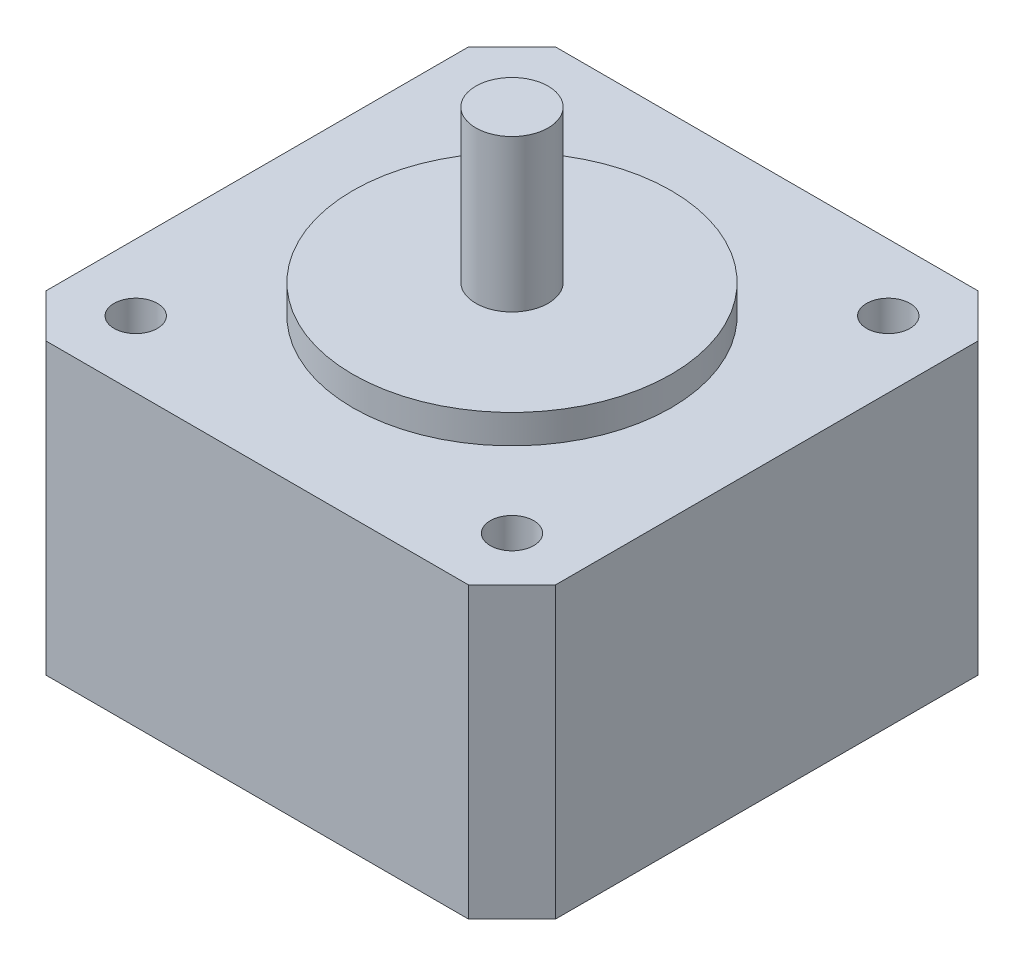
ISO-10303-21;
HEADER;
FILE_DESCRIPTION(('STEP AP214'),'2;1');
FILE_NAME('part.step','',(''),(''),'','','');
FILE_SCHEMA(('AUTOMOTIVE_DESIGN { 1 0 10303 214 1 1 1 1 }'));
ENDSEC;
DATA;
#1=APPLICATION_CONTEXT('core data for automotive mechanical design processes');
#2=APPLICATION_PROTOCOL_DEFINITION('international standard','automotive_design',2000,#1);
#3=PRODUCT_CONTEXT('',#1,'mechanical');
#4=PRODUCT('Part','Part','',(#3));
#5=PRODUCT_RELATED_PRODUCT_CATEGORY('part','',(#4));
#6=PRODUCT_DEFINITION_FORMATION('','',#4);
#7=PRODUCT_DEFINITION_CONTEXT('part definition',#1,'design');
#8=PRODUCT_DEFINITION('design','',#6,#7);
#9=PRODUCT_DEFINITION_SHAPE('','',#8);
#10=(LENGTH_UNIT() NAMED_UNIT(*) SI_UNIT(.MILLI.,.METRE.));
#11=(NAMED_UNIT(*) PLANE_ANGLE_UNIT() SI_UNIT($,.RADIAN.));
#12=(NAMED_UNIT(*) SI_UNIT($,.STERADIAN.) SOLID_ANGLE_UNIT());
#13=UNCERTAINTY_MEASURE_WITH_UNIT(LENGTH_MEASURE(1.E-05),#10,'distance_accuracy_value','');
#14=(GEOMETRIC_REPRESENTATION_CONTEXT(3) GLOBAL_UNCERTAINTY_ASSIGNED_CONTEXT((#13)) GLOBAL_UNIT_ASSIGNED_CONTEXT((#10,
#11,#12)) REPRESENTATION_CONTEXT('',''));
#15=CARTESIAN_POINT('',(0.,0.,0.));
#16=DIRECTION('',(0.,0.,1.));
#17=DIRECTION('',(1.,0.,0.));
#18=AXIS2_PLACEMENT_3D('',#15,#16,#17);
#19=CARTESIAN_POINT('',(17.6,20.,17.6));
#20=DIRECTION('',(-1.,0.,0.));
#21=DIRECTION('',(0.,0.,1.));
#22=AXIS2_PLACEMENT_3D('',#19,#20,#21);
#23=PLANE('',#22);
#24=DIRECTION('',(0.,0.,-1.));
#25=VECTOR('',#24,1.);
#26=CARTESIAN_POINT('',(17.6,0.,17.6));
#27=LINE('',#26,#25);
#28=CARTESIAN_POINT('',(17.6,0.,14.6));
#29=VERTEX_POINT('',#28);
#30=CARTESIAN_POINT('',(17.6,0.,-14.6));
#31=VERTEX_POINT('',#30);
#32=EDGE_CURVE('E166',#29,#31,#27,.T.);
#33=ORIENTED_EDGE('',*,*,#32,.T.);
#34=DIRECTION('',(0.,1.,0.));
#35=VECTOR('',#34,1.);
#36=CARTESIAN_POINT('',(17.6,20.,-14.6));
#37=LINE('',#36,#35);
#38=CARTESIAN_POINT('',(17.6,20.,-14.6));
#39=VERTEX_POINT('',#38);
#40=EDGE_CURVE('E11',#31,#39,#37,.T.);
#41=ORIENTED_EDGE('',*,*,#40,.T.);
#42=DIRECTION('',(0.,0.,-1.));
#43=VECTOR('',#42,1.);
#44=CARTESIAN_POINT('',(17.6,20.,17.6));
#45=LINE('',#44,#43);
#46=CARTESIAN_POINT('',(17.6,20.,14.6));
#47=VERTEX_POINT('',#46);
#48=EDGE_CURVE('E133',#47,#39,#45,.T.);
#49=ORIENTED_EDGE('',*,*,#48,.F.);
#50=DIRECTION('',(0.,-1.,0.));
#51=VECTOR('',#50,1.);
#52=CARTESIAN_POINT('',(17.6,20.,14.6));
#53=LINE('',#52,#51);
#54=EDGE_CURVE('E49',#47,#29,#53,.T.);
#55=ORIENTED_EDGE('',*,*,#54,.T.);
#56=EDGE_LOOP('',(#33,#41,#49,#55));
#57=FACE_BOUND('',#56,.T.);
#58=ADVANCED_FACE('F40',(#57),#23,.F.);
#59=CARTESIAN_POINT('',(-17.6,20.,-17.6));
#60=DIRECTION('',(0.,0.,1.));
#61=DIRECTION('',(1.,0.,0.));
#62=AXIS2_PLACEMENT_3D('',#59,#60,#61);
#63=PLANE('',#62);
#64=DIRECTION('',(-1.,0.,0.));
#65=VECTOR('',#64,1.);
#66=CARTESIAN_POINT('',(-17.6,0.,-17.6));
#67=LINE('',#66,#65);
#68=CARTESIAN_POINT('',(14.6,0.,-17.6));
#69=VERTEX_POINT('',#68);
#70=CARTESIAN_POINT('',(-14.6,0.,-17.6));
#71=VERTEX_POINT('',#70);
#72=EDGE_CURVE('E138',#69,#71,#67,.T.);
#73=ORIENTED_EDGE('',*,*,#72,.T.);
#74=DIRECTION('',(0.,1.,0.));
#75=VECTOR('',#74,1.);
#76=CARTESIAN_POINT('',(-14.6,20.,-17.6));
#77=LINE('',#76,#75);
#78=CARTESIAN_POINT('',(-14.6,20.,-17.6));
#79=VERTEX_POINT('',#78);
#80=EDGE_CURVE('E56',#71,#79,#77,.T.);
#81=ORIENTED_EDGE('',*,*,#80,.T.);
#82=DIRECTION('',(-1.,0.,0.));
#83=VECTOR('',#82,1.);
#84=CARTESIAN_POINT('',(-17.6,20.,-17.6));
#85=LINE('',#84,#83);
#86=CARTESIAN_POINT('',(14.6,20.,-17.6));
#87=VERTEX_POINT('',#86);
#88=EDGE_CURVE('E136',#87,#79,#85,.T.);
#89=ORIENTED_EDGE('',*,*,#88,.F.);
#90=DIRECTION('',(0.,-1.,0.));
#91=VECTOR('',#90,1.);
#92=CARTESIAN_POINT('',(14.6,20.,-17.6));
#93=LINE('',#92,#91);
#94=EDGE_CURVE('E158',#87,#69,#93,.T.);
#95=ORIENTED_EDGE('',*,*,#94,.T.);
#96=EDGE_LOOP('',(#73,#81,#89,#95));
#97=FACE_BOUND('',#96,.T.);
#98=ADVANCED_FACE('F231',(#97),#63,.F.);
#99=CARTESIAN_POINT('',(-17.6,20.,17.6));
#100=DIRECTION('',(1.,0.,0.));
#101=DIRECTION('',(0.,0.,-1.));
#102=AXIS2_PLACEMENT_3D('',#99,#100,#101);
#103=PLANE('',#102);
#104=DIRECTION('',(0.,0.,1.));
#105=VECTOR('',#104,1.);
#106=CARTESIAN_POINT('',(-17.6,0.,17.6));
#107=LINE('',#106,#105);
#108=CARTESIAN_POINT('',(-17.6,0.,-14.6));
#109=VERTEX_POINT('',#108);
#110=CARTESIAN_POINT('',(-17.6,0.,14.6));
#111=VERTEX_POINT('',#110);
#112=EDGE_CURVE('E134',#109,#111,#107,.T.);
#113=ORIENTED_EDGE('',*,*,#112,.T.);
#114=DIRECTION('',(0.,1.,0.));
#115=VECTOR('',#114,1.);
#116=CARTESIAN_POINT('',(-17.6,20.,14.6));
#117=LINE('',#116,#115);
#118=CARTESIAN_POINT('',(-17.6,20.,14.6));
#119=VERTEX_POINT('',#118);
#120=EDGE_CURVE('E112',#111,#119,#117,.T.);
#121=ORIENTED_EDGE('',*,*,#120,.T.);
#122=DIRECTION('',(0.,0.,1.));
#123=VECTOR('',#122,1.);
#124=CARTESIAN_POINT('',(-17.6,20.,17.6));
#125=LINE('',#124,#123);
#126=CARTESIAN_POINT('',(-17.6,20.,-14.6));
#127=VERTEX_POINT('',#126);
#128=EDGE_CURVE('E179',#127,#119,#125,.T.);
#129=ORIENTED_EDGE('',*,*,#128,.F.);
#130=DIRECTION('',(0.,-1.,0.));
#131=VECTOR('',#130,1.);
#132=CARTESIAN_POINT('',(-17.6,20.,-14.6));
#133=LINE('',#132,#131);
#134=EDGE_CURVE('E117',#127,#109,#133,.T.);
#135=ORIENTED_EDGE('',*,*,#134,.T.);
#136=EDGE_LOOP('',(#113,#121,#129,#135));
#137=FACE_BOUND('',#136,.T.);
#138=ADVANCED_FACE('F228',(#137),#103,.F.);
#139=CARTESIAN_POINT('',(-17.6,20.,17.6));
#140=DIRECTION('',(0.,0.,-1.));
#141=DIRECTION('',(-1.,0.,0.));
#142=AXIS2_PLACEMENT_3D('',#139,#140,#141);
#143=PLANE('',#142);
#144=DIRECTION('',(1.,0.,0.));
#145=VECTOR('',#144,1.);
#146=CARTESIAN_POINT('',(-17.6,20.,17.6));
#147=LINE('',#146,#145);
#148=CARTESIAN_POINT('',(-14.6,20.,17.6));
#149=VERTEX_POINT('',#148);
#150=CARTESIAN_POINT('',(14.6,20.,17.6));
#151=VERTEX_POINT('',#150);
#152=EDGE_CURVE('E127',#149,#151,#147,.T.);
#153=ORIENTED_EDGE('',*,*,#152,.F.);
#154=DIRECTION('',(0.,-1.,0.));
#155=VECTOR('',#154,1.);
#156=CARTESIAN_POINT('',(-14.6,20.,17.6));
#157=LINE('',#156,#155);
#158=CARTESIAN_POINT('',(-14.6,0.,17.6));
#159=VERTEX_POINT('',#158);
#160=EDGE_CURVE('E111',#149,#159,#157,.T.);
#161=ORIENTED_EDGE('',*,*,#160,.T.);
#162=DIRECTION('',(1.,0.,0.));
#163=VECTOR('',#162,1.);
#164=CARTESIAN_POINT('',(-17.6,0.,17.6));
#165=LINE('',#164,#163);
#166=CARTESIAN_POINT('',(14.6,0.,17.6));
#167=VERTEX_POINT('',#166);
#168=EDGE_CURVE('E124',#159,#167,#165,.T.);
#169=ORIENTED_EDGE('',*,*,#168,.T.);
#170=DIRECTION('',(0.,1.,0.));
#171=VECTOR('',#170,1.);
#172=CARTESIAN_POINT('',(14.6,20.,17.6));
#173=LINE('',#172,#171);
#174=EDGE_CURVE('E129',#167,#151,#173,.T.);
#175=ORIENTED_EDGE('',*,*,#174,.T.);
#176=EDGE_LOOP('',(#153,#161,#169,#175));
#177=FACE_BOUND('',#176,.T.);
#178=ADVANCED_FACE('F123',(#177),#143,.F.);
#179=CARTESIAN_POINT('',(0.,20.,0.));
#180=DIRECTION('',(0.,-1.,0.));
#181=DIRECTION('',(0.,0.,-1.));
#182=AXIS2_PLACEMENT_3D('',#179,#180,#181);
#183=PLANE('',#182);
#184=CARTESIAN_POINT('',(-13.0000000000001,20.,12.9999999999999));
#185=DIRECTION('',(0.,1.,0.));
#186=DIRECTION('',(0.,0.,1.));
#187=AXIS2_PLACEMENT_3D('',#184,#185,#186);
#188=CIRCLE('',#187,1.5);
#189=CARTESIAN_POINT('',(-13.0000000000001,20.,14.4999999999999));
#190=VERTEX_POINT('',#189);
#191=EDGE_CURVE('E199',#190,#190,#188,.T.);
#192=ORIENTED_EDGE('',*,*,#191,.F.);
#193=EDGE_LOOP('',(#192));
#194=FACE_BOUND('',#193,.T.);
#195=CARTESIAN_POINT('',(12.9999999999999,20.,13.0000000000001));
#196=DIRECTION('',(0.,1.,0.));
#197=DIRECTION('',(0.,0.,1.));
#198=AXIS2_PLACEMENT_3D('',#195,#196,#197);
#199=CIRCLE('',#198,1.5);
#200=CARTESIAN_POINT('',(12.9999999999999,20.,14.5000000000001));
#201=VERTEX_POINT('',#200);
#202=EDGE_CURVE('E205',#201,#201,#199,.T.);
#203=ORIENTED_EDGE('',*,*,#202,.F.);
#204=EDGE_LOOP('',(#203));
#205=FACE_BOUND('',#204,.T.);
#206=CARTESIAN_POINT('',(13.,20.,-13.));
#207=DIRECTION('',(0.,1.,0.));
#208=DIRECTION('',(0.,0.,1.));
#209=AXIS2_PLACEMENT_3D('',#206,#207,#208);
#210=CIRCLE('',#209,1.5);
#211=CARTESIAN_POINT('',(13.,20.,-11.5));
#212=VERTEX_POINT('',#211);
#213=EDGE_CURVE('E193',#212,#212,#210,.T.);
#214=ORIENTED_EDGE('',*,*,#213,.F.);
#215=EDGE_LOOP('',(#214));
#216=FACE_BOUND('',#215,.T.);
#217=CARTESIAN_POINT('',(-13.,20.,-13.));
#218=DIRECTION('',(0.,1.,0.));
#219=DIRECTION('',(0.,0.,1.));
#220=AXIS2_PLACEMENT_3D('',#217,#218,#219);
#221=CIRCLE('',#220,1.5);
#222=CARTESIAN_POINT('',(-13.,20.,-11.5));
#223=VERTEX_POINT('',#222);
#224=EDGE_CURVE('E190',#223,#223,#221,.T.);
#225=ORIENTED_EDGE('',*,*,#224,.F.);
#226=EDGE_LOOP('',(#225));
#227=FACE_BOUND('',#226,.T.);
#228=CARTESIAN_POINT('',(0.,20.,0.));
#229=DIRECTION('',(0.,1.,0.));
#230=DIRECTION('',(0.,0.,1.));
#231=AXIS2_PLACEMENT_3D('',#228,#229,#230);
#232=CIRCLE('',#231,11.);
#233=CARTESIAN_POINT('',(0.,20.,11.));
#234=VERTEX_POINT('',#233);
#235=EDGE_CURVE('E178',#234,#234,#232,.T.);
#236=ORIENTED_EDGE('',*,*,#235,.F.);
#237=EDGE_LOOP('',(#236));
#238=FACE_BOUND('',#237,.T.);
#239=ORIENTED_EDGE('',*,*,#128,.T.);
#240=DIRECTION('',(-0.707106781186546,0.,-0.707106781186549));
#241=VECTOR('',#240,1.);
#242=CARTESIAN_POINT('',(-14.6,20.,17.6));
#243=LINE('',#242,#241);
#244=EDGE_CURVE('E156',#119,#149,#243,.F.);
#245=ORIENTED_EDGE('',*,*,#244,.T.);
#246=ORIENTED_EDGE('',*,*,#152,.T.);
#247=DIRECTION('',(-0.707106781186549,0.,0.707106781186546));
#248=VECTOR('',#247,1.);
#249=CARTESIAN_POINT('',(17.6,20.,14.6));
#250=LINE('',#249,#248);
#251=EDGE_CURVE('E151',#151,#47,#250,.F.);
#252=ORIENTED_EDGE('',*,*,#251,.T.);
#253=ORIENTED_EDGE('',*,*,#48,.T.);
#254=DIRECTION('',(0.707106781186546,0.,0.707106781186549));
#255=VECTOR('',#254,1.);
#256=CARTESIAN_POINT('',(14.6,20.,-17.6));
#257=LINE('',#256,#255);
#258=EDGE_CURVE('E63',#39,#87,#257,.F.);
#259=ORIENTED_EDGE('',*,*,#258,.T.);
#260=ORIENTED_EDGE('',*,*,#88,.T.);
#261=DIRECTION('',(0.707106781186549,0.,-0.707106781186546));
#262=VECTOR('',#261,1.);
#263=CARTESIAN_POINT('',(-17.6,20.,-14.6));
#264=LINE('',#263,#262);
#265=EDGE_CURVE('E154',#79,#127,#264,.F.);
#266=ORIENTED_EDGE('',*,*,#265,.T.);
#267=EDGE_LOOP('',(#239,#245,#246,#252,#253,#259,#260,#266));
#268=FACE_BOUND('',#267,.T.);
#269=ADVANCED_FACE('F216',(#194,#205,#216,#227,#238,#268),#183,.F.);
#270=CARTESIAN_POINT('',(0.,0.,0.));
#271=DIRECTION('',(0.,-1.,0.));
#272=DIRECTION('',(0.,0.,-1.));
#273=AXIS2_PLACEMENT_3D('',#270,#271,#272);
#274=PLANE('',#273);
#275=ORIENTED_EDGE('',*,*,#168,.F.);
#276=DIRECTION('',(0.707106781186546,0.,0.707106781186549));
#277=VECTOR('',#276,1.);
#278=CARTESIAN_POINT('',(-16.1,0.,16.1));
#279=LINE('',#278,#277);
#280=EDGE_CURVE('E107',#159,#111,#279,.F.);
#281=ORIENTED_EDGE('',*,*,#280,.T.);
#282=ORIENTED_EDGE('',*,*,#112,.F.);
#283=DIRECTION('',(-0.707106781186549,0.,0.707106781186546));
#284=VECTOR('',#283,1.);
#285=CARTESIAN_POINT('',(-16.1,0.,-16.1));
#286=LINE('',#285,#284);
#287=EDGE_CURVE('E118',#109,#71,#286,.F.);
#288=ORIENTED_EDGE('',*,*,#287,.T.);
#289=ORIENTED_EDGE('',*,*,#72,.F.);
#290=DIRECTION('',(-0.707106781186546,0.,-0.707106781186549));
#291=VECTOR('',#290,1.);
#292=CARTESIAN_POINT('',(16.1,0.,-16.1));
#293=LINE('',#292,#291);
#294=EDGE_CURVE('E145',#69,#31,#293,.F.);
#295=ORIENTED_EDGE('',*,*,#294,.T.);
#296=ORIENTED_EDGE('',*,*,#32,.F.);
#297=DIRECTION('',(0.707106781186549,0.,-0.707106781186546));
#298=VECTOR('',#297,1.);
#299=CARTESIAN_POINT('',(16.1,0.,16.1));
#300=LINE('',#299,#298);
#301=EDGE_CURVE('E128',#29,#167,#300,.F.);
#302=ORIENTED_EDGE('',*,*,#301,.T.);
#303=EDGE_LOOP('',(#275,#281,#282,#288,#289,#295,#296,#302));
#304=FACE_BOUND('',#303,.T.);
#305=ADVANCED_FACE('F131',(#304),#274,.T.);
#306=CARTESIAN_POINT('',(0.,22.,0.));
#307=DIRECTION('',(0.,-1.,0.));
#308=DIRECTION('',(0.,0.,-1.));
#309=AXIS2_PLACEMENT_3D('',#306,#307,#308);
#310=CYLINDRICAL_SURFACE('',#309,11.);
#311=CARTESIAN_POINT('',(0.,22.,0.));
#312=DIRECTION('',(0.,1.,0.));
#313=DIRECTION('',(0.,0.,1.));
#314=AXIS2_PLACEMENT_3D('',#311,#312,#313);
#315=CIRCLE('',#314,11.);
#316=CARTESIAN_POINT('',(0.,22.,11.));
#317=VERTEX_POINT('',#316);
#318=EDGE_CURVE('E171',#317,#317,#315,.T.);
#319=ORIENTED_EDGE('',*,*,#318,.F.);
#320=EDGE_LOOP('',(#319));
#321=FACE_BOUND('',#320,.T.);
#322=ORIENTED_EDGE('',*,*,#235,.T.);
#323=EDGE_LOOP('',(#322));
#324=FACE_BOUND('',#323,.T.);
#325=ADVANCED_FACE('F395',(#321,#324),#310,.T.);
#326=CARTESIAN_POINT('',(0.,22.,0.));
#327=DIRECTION('',(0.,1.,0.));
#328=DIRECTION('',(0.,0.,1.));
#329=AXIS2_PLACEMENT_3D('',#326,#327,#328);
#330=PLANE('',#329);
#331=CARTESIAN_POINT('',(0.,22.,0.));
#332=DIRECTION('',(0.,1.,0.));
#333=DIRECTION('',(0.,0.,1.));
#334=AXIS2_PLACEMENT_3D('',#331,#332,#333);
#335=CIRCLE('',#334,2.5);
#336=CARTESIAN_POINT('',(0.,22.,-2.5));
#337=VERTEX_POINT('',#336);
#338=EDGE_CURVE('E142',#337,#337,#335,.T.);
#339=ORIENTED_EDGE('',*,*,#338,.F.);
#340=EDGE_LOOP('',(#339));
#341=FACE_BOUND('',#340,.T.);
#342=ORIENTED_EDGE('',*,*,#318,.T.);
#343=EDGE_LOOP('',(#342));
#344=FACE_BOUND('',#343,.T.);
#345=ADVANCED_FACE('F385',(#341,#344),#330,.T.);
#346=CARTESIAN_POINT('',(0.,32.5,0.));
#347=DIRECTION('',(0.,-1.,0.));
#348=DIRECTION('',(0.,0.,-1.));
#349=AXIS2_PLACEMENT_3D('',#346,#347,#348);
#350=CYLINDRICAL_SURFACE('',#349,2.5);
#351=CARTESIAN_POINT('',(0.,32.5,0.));
#352=DIRECTION('',(0.,1.,0.));
#353=DIRECTION('',(0.,0.,1.));
#354=AXIS2_PLACEMENT_3D('',#351,#352,#353);
#355=CIRCLE('',#354,2.5);
#356=CARTESIAN_POINT('',(0.,32.5,-2.5));
#357=VERTEX_POINT('',#356);
#358=EDGE_CURVE('E174',#357,#357,#355,.T.);
#359=CARTESIAN_POINT('',(0.,32.5,-2.5));
#360=CARTESIAN_POINT('',(0.,32.390625,-2.5));
#361=CARTESIAN_POINT('',(0.,32.28125,-2.5));
#362=CARTESIAN_POINT('',(0.,32.0625,-2.5));
#363=CARTESIAN_POINT('',(0.,31.953125,-2.5));
#364=CARTESIAN_POINT('',(0.,31.734375,-2.5));
#365=CARTESIAN_POINT('',(0.,31.625,-2.5));
#366=CARTESIAN_POINT('',(0.,31.40625,-2.5));
#367=CARTESIAN_POINT('',(0.,31.296875,-2.5));
#368=CARTESIAN_POINT('',(0.,31.078125,-2.5));
#369=CARTESIAN_POINT('',(0.,30.96875,-2.5));
#370=CARTESIAN_POINT('',(0.,30.75,-2.5));
#371=CARTESIAN_POINT('',(0.,30.640625,-2.5));
#372=CARTESIAN_POINT('',(0.,30.421875,-2.5));
#373=CARTESIAN_POINT('',(0.,30.3125,-2.5));
#374=CARTESIAN_POINT('',(0.,30.09375,-2.5));
#375=CARTESIAN_POINT('',(0.,29.984375,-2.5));
#376=CARTESIAN_POINT('',(0.,29.765625,-2.5));
#377=CARTESIAN_POINT('',(0.,29.65625,-2.5));
#378=CARTESIAN_POINT('',(0.,29.4375,-2.5));
#379=CARTESIAN_POINT('',(0.,29.328125,-2.5));
#380=CARTESIAN_POINT('',(0.,29.109375,-2.5));
#381=CARTESIAN_POINT('',(0.,29.,-2.5));
#382=CARTESIAN_POINT('',(0.,28.78125,-2.5));
#383=CARTESIAN_POINT('',(0.,28.671875,-2.5));
#384=CARTESIAN_POINT('',(0.,28.453125,-2.5));
#385=CARTESIAN_POINT('',(0.,28.34375,-2.5));
#386=CARTESIAN_POINT('',(0.,28.125,-2.5));
#387=CARTESIAN_POINT('',(0.,28.015625,-2.5));
#388=CARTESIAN_POINT('',(0.,27.796875,-2.5));
#389=CARTESIAN_POINT('',(0.,27.6875,-2.5));
#390=CARTESIAN_POINT('',(0.,27.46875,-2.5));
#391=CARTESIAN_POINT('',(0.,27.359375,-2.5));
#392=CARTESIAN_POINT('',(0.,27.140625,-2.5));
#393=CARTESIAN_POINT('',(0.,27.03125,-2.5));
#394=CARTESIAN_POINT('',(0.,26.8125,-2.5));
#395=CARTESIAN_POINT('',(0.,26.703125,-2.5));
#396=CARTESIAN_POINT('',(0.,26.484375,-2.5));
#397=CARTESIAN_POINT('',(0.,26.375,-2.5));
#398=CARTESIAN_POINT('',(0.,26.15625,-2.5));
#399=CARTESIAN_POINT('',(0.,26.046875,-2.5));
#400=CARTESIAN_POINT('',(0.,25.828125,-2.5));
#401=CARTESIAN_POINT('',(0.,25.71875,-2.5));
#402=CARTESIAN_POINT('',(0.,25.5,-2.5));
#403=CARTESIAN_POINT('',(0.,25.390625,-2.5));
#404=CARTESIAN_POINT('',(0.,25.171875,-2.5));
#405=CARTESIAN_POINT('',(0.,25.0625,-2.5));
#406=CARTESIAN_POINT('',(0.,24.84375,-2.5));
#407=CARTESIAN_POINT('',(0.,24.734375,-2.5));
#408=CARTESIAN_POINT('',(0.,24.515625,-2.5));
#409=CARTESIAN_POINT('',(0.,24.40625,-2.5));
#410=CARTESIAN_POINT('',(0.,24.1875,-2.5));
#411=CARTESIAN_POINT('',(0.,24.078125,-2.5));
#412=CARTESIAN_POINT('',(0.,23.859375,-2.5));
#413=CARTESIAN_POINT('',(0.,23.75,-2.5));
#414=CARTESIAN_POINT('',(0.,23.53125,-2.5));
#415=CARTESIAN_POINT('',(0.,23.421875,-2.5));
#416=CARTESIAN_POINT('',(0.,23.203125,-2.5));
#417=CARTESIAN_POINT('',(0.,23.09375,-2.5));
#418=CARTESIAN_POINT('',(0.,22.875,-2.5));
#419=CARTESIAN_POINT('',(0.,22.765625,-2.5));
#420=CARTESIAN_POINT('',(0.,22.546875,-2.5));
#421=CARTESIAN_POINT('',(0.,22.4375,-2.5));
#422=CARTESIAN_POINT('',(0.,22.21875,-2.5));
#423=CARTESIAN_POINT('',(0.,22.109375,-2.5));
#424=CARTESIAN_POINT('',(0.,22.,-2.5));
#425=B_SPLINE_CURVE_WITH_KNOTS('',3,(#359,#360,#361,#362,#363,#364,#365,#366,#367,#368,#369,
#370,#371,#372,#373,#374,#375,#376,#377,#378,#379,#380,#381,#382,#383,#384,#385,#386,#387,#388,
#389,#390,#391,#392,#393,#394,#395,#396,#397,#398,#399,#400,#401,#402,#403,#404,#405,#406,#407,
#408,#409,#410,#411,#412,#413,#414,#415,#416,#417,#418,#419,#420,#421,#422,#423,#424),
.UNSPECIFIED.,.F.,.F.,(4,2,2,2,2,2,2,2,2,2,2,2,2,2,2,2,2,2,2,2,2,2,2,2,2,2,2,2,2,2,2,2,4),(0.,
0.328125000000005,0.656250000000004,0.984375000000003,1.3125,1.640625,1.96875000000001,2.296875,
2.625,2.953125,3.28125,3.609375,3.9375,4.265625,4.59375,4.921875,5.25,5.578125,5.90625000000001,
6.234375,6.56250000000001,6.890625,7.21875,7.54687500000001,7.875,8.20312500000001,8.53125,
8.859375,9.1875,9.515625,9.84375000000001,10.171875,10.5),.UNSPECIFIED.);
#426=EDGE_CURVE('BSEAM375',#357,#337,#425,.T.);
#427=ORIENTED_EDGE('',*,*,#358,.F.);
#428=ORIENTED_EDGE('',*,*,#338,.T.);
#429=ORIENTED_EDGE('',*,*,#426,.T.);
#430=ORIENTED_EDGE('',*,*,#426,.F.);
#431=EDGE_LOOP('',(#427,#429,#428,#430));
#432=FACE_BOUND('',#431,.T.);
#433=ADVANCED_FACE('F375',(#432),#350,.T.);
#434=CARTESIAN_POINT('',(0.,32.5,0.));
#435=DIRECTION('',(0.,1.,0.));
#436=DIRECTION('',(0.,0.,1.));
#437=AXIS2_PLACEMENT_3D('',#434,#435,#436);
#438=PLANE('',#437);
#439=ORIENTED_EDGE('',*,*,#358,.T.);
#440=EDGE_LOOP('',(#439));
#441=FACE_BOUND('',#440,.T.);
#442=ADVANCED_FACE('F365',(#441),#438,.T.);
#443=CARTESIAN_POINT('',(-13.,15.5,-13.));
#444=DIRECTION('',(0.,1.,0.));
#445=DIRECTION('',(0.,0.,1.));
#446=AXIS2_PLACEMENT_3D('',#443,#444,#445);
#447=CYLINDRICAL_SURFACE('',#446,1.5);
#448=CARTESIAN_POINT('',(-13.,15.5,-13.));
#449=DIRECTION('',(0.,1.,0.));
#450=DIRECTION('',(0.,0.,1.));
#451=AXIS2_PLACEMENT_3D('',#448,#449,#450);
#452=CIRCLE('',#451,1.5);
#453=CARTESIAN_POINT('',(-13.,15.5,-11.5));
#454=VERTEX_POINT('',#453);
#455=EDGE_CURVE('E189',#454,#454,#452,.T.);
#456=ORIENTED_EDGE('',*,*,#455,.F.);
#457=EDGE_LOOP('',(#456));
#458=FACE_BOUND('',#457,.T.);
#459=ORIENTED_EDGE('',*,*,#224,.T.);
#460=EDGE_LOOP('',(#459));
#461=FACE_BOUND('',#460,.T.);
#462=ADVANCED_FACE('F355',(#458,#461),#447,.F.);
#463=CARTESIAN_POINT('',(-13.,15.5,-13.));
#464=DIRECTION('',(0.,1.,0.));
#465=DIRECTION('',(0.,0.,1.));
#466=AXIS2_PLACEMENT_3D('',#463,#464,#465);
#467=PLANE('',#466);
#468=ORIENTED_EDGE('',*,*,#455,.T.);
#469=EDGE_LOOP('',(#468));
#470=FACE_BOUND('',#469,.T.);
#471=ADVANCED_FACE('F345',(#470),#467,.T.);
#472=CARTESIAN_POINT('',(13.,15.5,-13.));
#473=DIRECTION('',(0.,1.,0.));
#474=DIRECTION('',(0.,0.,1.));
#475=AXIS2_PLACEMENT_3D('',#472,#473,#474);
#476=CYLINDRICAL_SURFACE('',#475,1.5);
#477=CARTESIAN_POINT('',(13.,15.5,-13.));
#478=DIRECTION('',(0.,1.,0.));
#479=DIRECTION('',(0.,0.,1.));
#480=AXIS2_PLACEMENT_3D('',#477,#478,#479);
#481=CIRCLE('',#480,1.5);
#482=CARTESIAN_POINT('',(13.,15.5,-11.5));
#483=VERTEX_POINT('',#482);
#484=EDGE_CURVE('E208',#483,#483,#481,.T.);
#485=ORIENTED_EDGE('',*,*,#484,.F.);
#486=EDGE_LOOP('',(#485));
#487=FACE_BOUND('',#486,.T.);
#488=ORIENTED_EDGE('',*,*,#213,.T.);
#489=EDGE_LOOP('',(#488));
#490=FACE_BOUND('',#489,.T.);
#491=ADVANCED_FACE('F214',(#487,#490),#476,.F.);
#492=CARTESIAN_POINT('',(13.,15.5,-13.));
#493=DIRECTION('',(0.,1.,0.));
#494=DIRECTION('',(0.,0.,1.));
#495=AXIS2_PLACEMENT_3D('',#492,#493,#494);
#496=PLANE('',#495);
#497=ORIENTED_EDGE('',*,*,#484,.T.);
#498=EDGE_LOOP('',(#497));
#499=FACE_BOUND('',#498,.T.);
#500=ADVANCED_FACE('F326',(#499),#496,.T.);
#501=CARTESIAN_POINT('',(12.9999999999999,15.5,13.0000000000001));
#502=DIRECTION('',(0.,1.,0.));
#503=DIRECTION('',(0.,0.,1.));
#504=AXIS2_PLACEMENT_3D('',#501,#502,#503);
#505=CYLINDRICAL_SURFACE('',#504,1.5);
#506=CARTESIAN_POINT('',(12.9999999999999,15.5,13.0000000000001));
#507=DIRECTION('',(0.,1.,0.));
#508=DIRECTION('',(0.,0.,1.));
#509=AXIS2_PLACEMENT_3D('',#506,#507,#508);
#510=CIRCLE('',#509,1.5);
#511=CARTESIAN_POINT('',(12.9999999999999,15.5,14.5000000000001));
#512=VERTEX_POINT('',#511);
#513=EDGE_CURVE('E202',#512,#512,#510,.T.);
#514=ORIENTED_EDGE('',*,*,#513,.F.);
#515=EDGE_LOOP('',(#514));
#516=FACE_BOUND('',#515,.T.);
#517=ORIENTED_EDGE('',*,*,#202,.T.);
#518=EDGE_LOOP('',(#517));
#519=FACE_BOUND('',#518,.T.);
#520=ADVANCED_FACE('F316',(#516,#519),#505,.F.);
#521=CARTESIAN_POINT('',(12.9999999999999,15.5,13.0000000000001));
#522=DIRECTION('',(0.,1.,0.));
#523=DIRECTION('',(0.,0.,1.));
#524=AXIS2_PLACEMENT_3D('',#521,#522,#523);
#525=PLANE('',#524);
#526=ORIENTED_EDGE('',*,*,#513,.T.);
#527=EDGE_LOOP('',(#526));
#528=FACE_BOUND('',#527,.T.);
#529=ADVANCED_FACE('F306',(#528),#525,.T.);
#530=CARTESIAN_POINT('',(-13.0000000000001,15.5,12.9999999999999));
#531=DIRECTION('',(0.,1.,0.));
#532=DIRECTION('',(0.,0.,1.));
#533=AXIS2_PLACEMENT_3D('',#530,#531,#532);
#534=CYLINDRICAL_SURFACE('',#533,1.5);
#535=CARTESIAN_POINT('',(-13.0000000000001,15.5,12.9999999999999));
#536=DIRECTION('',(0.,1.,0.));
#537=DIRECTION('',(0.,0.,1.));
#538=AXIS2_PLACEMENT_3D('',#535,#536,#537);
#539=CIRCLE('',#538,1.5);
#540=CARTESIAN_POINT('',(-13.0000000000001,15.5,14.4999999999999));
#541=VERTEX_POINT('',#540);
#542=EDGE_CURVE('E196',#541,#541,#539,.T.);
#543=ORIENTED_EDGE('',*,*,#542,.F.);
#544=EDGE_LOOP('',(#543));
#545=FACE_BOUND('',#544,.T.);
#546=ORIENTED_EDGE('',*,*,#191,.T.);
#547=EDGE_LOOP('',(#546));
#548=FACE_BOUND('',#547,.T.);
#549=ADVANCED_FACE('F296',(#545,#548),#534,.F.);
#550=CARTESIAN_POINT('',(-13.0000000000001,15.5,12.9999999999999));
#551=DIRECTION('',(0.,1.,0.));
#552=DIRECTION('',(0.,0.,1.));
#553=AXIS2_PLACEMENT_3D('',#550,#551,#552);
#554=PLANE('',#553);
#555=ORIENTED_EDGE('',*,*,#542,.T.);
#556=EDGE_LOOP('',(#555));
#557=FACE_BOUND('',#556,.T.);
#558=ADVANCED_FACE('F253',(#557),#554,.T.);
#559=CARTESIAN_POINT('',(-14.6,20.,17.6));
#560=DIRECTION('',(0.707106781186549,0.,-0.707106781186546));
#561=DIRECTION('',(0.,-1.,0.));
#562=AXIS2_PLACEMENT_3D('',#559,#560,#561);
#563=PLANE('',#562);
#564=ORIENTED_EDGE('',*,*,#244,.F.);
#565=ORIENTED_EDGE('',*,*,#120,.F.);
#566=ORIENTED_EDGE('',*,*,#280,.F.);
#567=ORIENTED_EDGE('',*,*,#160,.F.);
#568=EDGE_LOOP('',(#564,#565,#566,#567));
#569=FACE_BOUND('',#568,.T.);
#570=ADVANCED_FACE('F110',(#569),#563,.F.);
#571=CARTESIAN_POINT('',(-17.6,20.,-14.6));
#572=DIRECTION('',(0.707106781186546,0.,0.707106781186549));
#573=DIRECTION('',(0.,-1.,0.));
#574=AXIS2_PLACEMENT_3D('',#571,#572,#573);
#575=PLANE('',#574);
#576=ORIENTED_EDGE('',*,*,#265,.F.);
#577=ORIENTED_EDGE('',*,*,#80,.F.);
#578=ORIENTED_EDGE('',*,*,#287,.F.);
#579=ORIENTED_EDGE('',*,*,#134,.F.);
#580=EDGE_LOOP('',(#576,#577,#578,#579));
#581=FACE_BOUND('',#580,.T.);
#582=ADVANCED_FACE('F230',(#581),#575,.F.);
#583=CARTESIAN_POINT('',(14.6,20.,-17.6));
#584=DIRECTION('',(-0.707106781186549,0.,0.707106781186546));
#585=DIRECTION('',(0.,-1.,0.));
#586=AXIS2_PLACEMENT_3D('',#583,#584,#585);
#587=PLANE('',#586);
#588=ORIENTED_EDGE('',*,*,#258,.F.);
#589=ORIENTED_EDGE('',*,*,#40,.F.);
#590=ORIENTED_EDGE('',*,*,#294,.F.);
#591=ORIENTED_EDGE('',*,*,#94,.F.);
#592=EDGE_LOOP('',(#588,#589,#590,#591));
#593=FACE_BOUND('',#592,.T.);
#594=ADVANCED_FACE('F234',(#593),#587,.F.);
#595=CARTESIAN_POINT('',(17.6,20.,14.6));
#596=DIRECTION('',(-0.707106781186546,0.,-0.707106781186549));
#597=DIRECTION('',(0.,-1.,0.));
#598=AXIS2_PLACEMENT_3D('',#595,#596,#597);
#599=PLANE('',#598);
#600=ORIENTED_EDGE('',*,*,#251,.F.);
#601=ORIENTED_EDGE('',*,*,#174,.F.);
#602=ORIENTED_EDGE('',*,*,#301,.F.);
#603=ORIENTED_EDGE('',*,*,#54,.F.);
#604=EDGE_LOOP('',(#600,#601,#602,#603));
#605=FACE_BOUND('',#604,.T.);
#606=ADVANCED_FACE('F43',(#605),#599,.F.);
#607=CLOSED_SHELL('',(#58,#98,#138,#178,#269,#305,#325,#345,#433,#442,#462,#471,#491,#500,#520,
#529,#549,#558,#570,#582,#594,#606));
#608=MANIFOLD_SOLID_BREP('B2',#607);
#609=ADVANCED_BREP_SHAPE_REPRESENTATION('',(#18,#608),#14);
#610=SHAPE_DEFINITION_REPRESENTATION(#9,#609);
ENDSEC;
END-ISO-10303-21;
